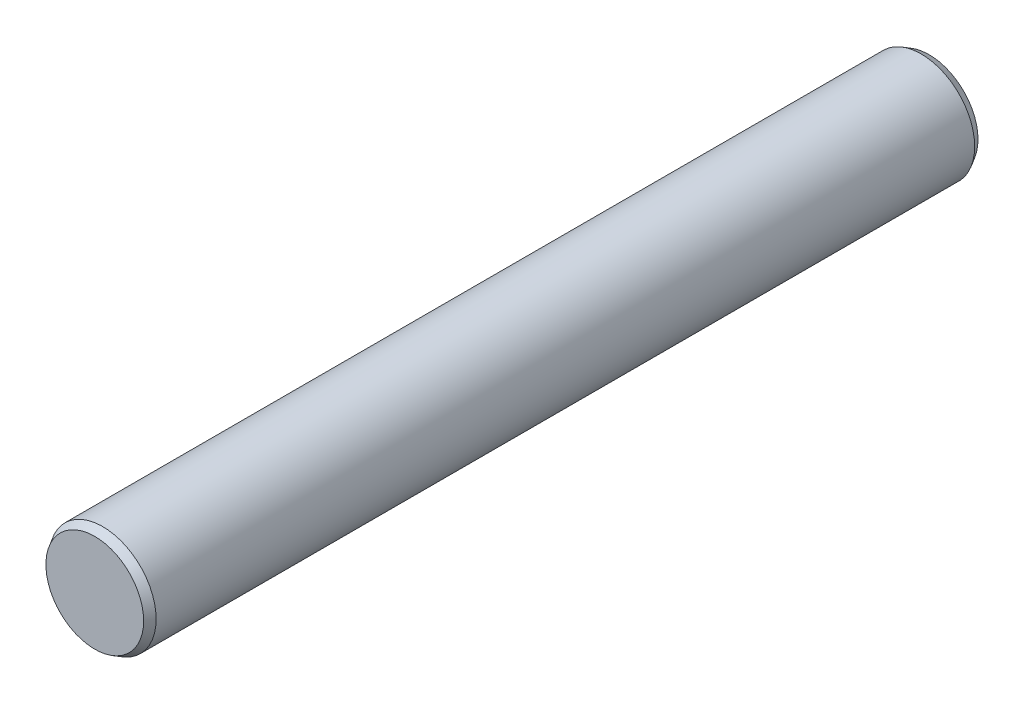
ISO-10303-21;
HEADER;
FILE_DESCRIPTION(('STEP AP214'),'2;1');
FILE_NAME('part.step','',(''),(''),'','','');
FILE_SCHEMA(('AUTOMOTIVE_DESIGN { 1 0 10303 214 1 1 1 1 }'));
ENDSEC;
DATA;
#1=APPLICATION_CONTEXT('core data for automotive mechanical design processes');
#2=APPLICATION_PROTOCOL_DEFINITION('international standard','automotive_design',2000,#1);
#3=PRODUCT_CONTEXT('',#1,'mechanical');
#4=PRODUCT('Part','Part','',(#3));
#5=PRODUCT_RELATED_PRODUCT_CATEGORY('part','',(#4));
#6=PRODUCT_DEFINITION_FORMATION('','',#4);
#7=PRODUCT_DEFINITION_CONTEXT('part definition',#1,'design');
#8=PRODUCT_DEFINITION('design','',#6,#7);
#9=PRODUCT_DEFINITION_SHAPE('','',#8);
#10=(LENGTH_UNIT() NAMED_UNIT(*) SI_UNIT(.MILLI.,.METRE.));
#11=(NAMED_UNIT(*) PLANE_ANGLE_UNIT() SI_UNIT($,.RADIAN.));
#12=(NAMED_UNIT(*) SI_UNIT($,.STERADIAN.) SOLID_ANGLE_UNIT());
#13=UNCERTAINTY_MEASURE_WITH_UNIT(LENGTH_MEASURE(1.E-05),#10,'distance_accuracy_value','');
#14=(GEOMETRIC_REPRESENTATION_CONTEXT(3) GLOBAL_UNCERTAINTY_ASSIGNED_CONTEXT((#13)) GLOBAL_UNIT_ASSIGNED_CONTEXT((#10,
#11,#12)) REPRESENTATION_CONTEXT('',''));
#15=CARTESIAN_POINT('',(0.,0.,0.));
#16=DIRECTION('',(0.,0.,1.));
#17=DIRECTION('',(1.,0.,0.));
#18=AXIS2_PLACEMENT_3D('',#15,#16,#17);
#19=CARTESIAN_POINT('',(0.,0.,13.3858));
#20=DIRECTION('',(0.,0.,-1.));
#21=DIRECTION('',(-1.,0.,0.));
#22=AXIS2_PLACEMENT_3D('',#19,#20,#21);
#23=CYLINDRICAL_SURFACE('',#22,1.7145);
#24=CARTESIAN_POINT('',(0.,0.,-13.1318));
#25=DIRECTION('',(0.,0.,1.));
#26=DIRECTION('',(1.,0.,0.));
#27=AXIS2_PLACEMENT_3D('',#24,#25,#26);
#28=CIRCLE('',#27,1.7145);
#29=CARTESIAN_POINT('',(1.7145,0.,-13.1318));
#30=VERTEX_POINT('',#29);
#31=EDGE_CURVE('E36',#30,#30,#28,.T.);
#32=ORIENTED_EDGE('',*,*,#31,.T.);
#33=EDGE_LOOP('',(#32));
#34=FACE_BOUND('',#33,.T.);
#35=CARTESIAN_POINT('',(0.,0.,13.1318));
#36=DIRECTION('',(0.,0.,1.));
#37=DIRECTION('',(1.,0.,0.));
#38=AXIS2_PLACEMENT_3D('',#35,#36,#37);
#39=CIRCLE('',#38,1.7145);
#40=CARTESIAN_POINT('',(1.7145,0.,13.1318));
#41=VERTEX_POINT('',#40);
#42=EDGE_CURVE('E40',#41,#41,#39,.F.);
#43=ORIENTED_EDGE('',*,*,#42,.T.);
#44=EDGE_LOOP('',(#43));
#45=FACE_BOUND('',#44,.T.);
#46=ADVANCED_FACE('F30',(#34,#45),#23,.T.);
#47=CARTESIAN_POINT('',(0.,0.,13.3858));
#48=DIRECTION('',(0.,0.,1.));
#49=DIRECTION('',(1.,0.,0.));
#50=AXIS2_PLACEMENT_3D('',#47,#48,#49);
#51=PLANE('',#50);
#52=CARTESIAN_POINT('',(0.,0.,13.3858));
#53=DIRECTION('',(0.,0.,1.));
#54=DIRECTION('',(1.,0.,0.));
#55=AXIS2_PLACEMENT_3D('',#52,#53,#54);
#56=CIRCLE('',#55,1.56785303162584);
#57=CARTESIAN_POINT('',(1.56785303162584,0.,13.3858));
#58=VERTEX_POINT('',#57);
#59=EDGE_CURVE('E44',#58,#58,#56,.T.);
#60=ORIENTED_EDGE('',*,*,#59,.T.);
#61=EDGE_LOOP('',(#60));
#62=FACE_BOUND('',#61,.T.);
#63=ADVANCED_FACE('F50',(#62),#51,.T.);
#64=CARTESIAN_POINT('',(0.,0.,-13.3858));
#65=DIRECTION('',(0.,0.,1.));
#66=DIRECTION('',(1.,0.,0.));
#67=AXIS2_PLACEMENT_3D('',#64,#65,#66);
#68=PLANE('',#67);
#69=CARTESIAN_POINT('',(0.,0.,-13.3858));
#70=DIRECTION('',(0.,0.,1.));
#71=DIRECTION('',(1.,0.,0.));
#72=AXIS2_PLACEMENT_3D('',#69,#70,#71);
#73=CIRCLE('',#72,1.56785303162584);
#74=CARTESIAN_POINT('',(1.56785303162584,0.,-13.3858));
#75=VERTEX_POINT('',#74);
#76=EDGE_CURVE('E10',#75,#75,#73,.F.);
#77=ORIENTED_EDGE('',*,*,#76,.T.);
#78=EDGE_LOOP('',(#77));
#79=FACE_BOUND('',#78,.T.);
#80=ADVANCED_FACE('F55',(#79),#68,.F.);
#81=CARTESIAN_POINT('',(0.,0.,13.3858));
#82=DIRECTION('',(0.,0.,-1.));
#83=DIRECTION('',(-1.,0.,0.));
#84=AXIS2_PLACEMENT_3D('',#81,#82,#83);
#85=CONICAL_SURFACE('',#84,1.56785303162584,0.523598775598291);
#86=ORIENTED_EDGE('',*,*,#42,.F.);
#87=EDGE_LOOP('',(#86));
#88=FACE_BOUND('',#87,.T.);
#89=ORIENTED_EDGE('',*,*,#59,.F.);
#90=EDGE_LOOP('',(#89));
#91=FACE_BOUND('',#90,.T.);
#92=ADVANCED_FACE('F52',(#88,#91),#85,.T.);
#93=CARTESIAN_POINT('',(0.,0.,-13.1318));
#94=DIRECTION('',(0.,0.,1.));
#95=DIRECTION('',(1.,0.,0.));
#96=AXIS2_PLACEMENT_3D('',#93,#94,#95);
#97=CONICAL_SURFACE('',#96,1.7145,0.523598775598293);
#98=ORIENTED_EDGE('',*,*,#76,.F.);
#99=EDGE_LOOP('',(#98));
#100=FACE_BOUND('',#99,.T.);
#101=ORIENTED_EDGE('',*,*,#31,.F.);
#102=EDGE_LOOP('',(#101));
#103=FACE_BOUND('',#102,.T.);
#104=ADVANCED_FACE('F54',(#100,#103),#97,.T.);
#105=CLOSED_SHELL('',(#46,#63,#80,#92,#104));
#106=MANIFOLD_SOLID_BREP('B2',#105);
#107=ADVANCED_BREP_SHAPE_REPRESENTATION('',(#18,#106),#14);
#108=SHAPE_DEFINITION_REPRESENTATION(#9,#107);
ENDSEC;
END-ISO-10303-21;
